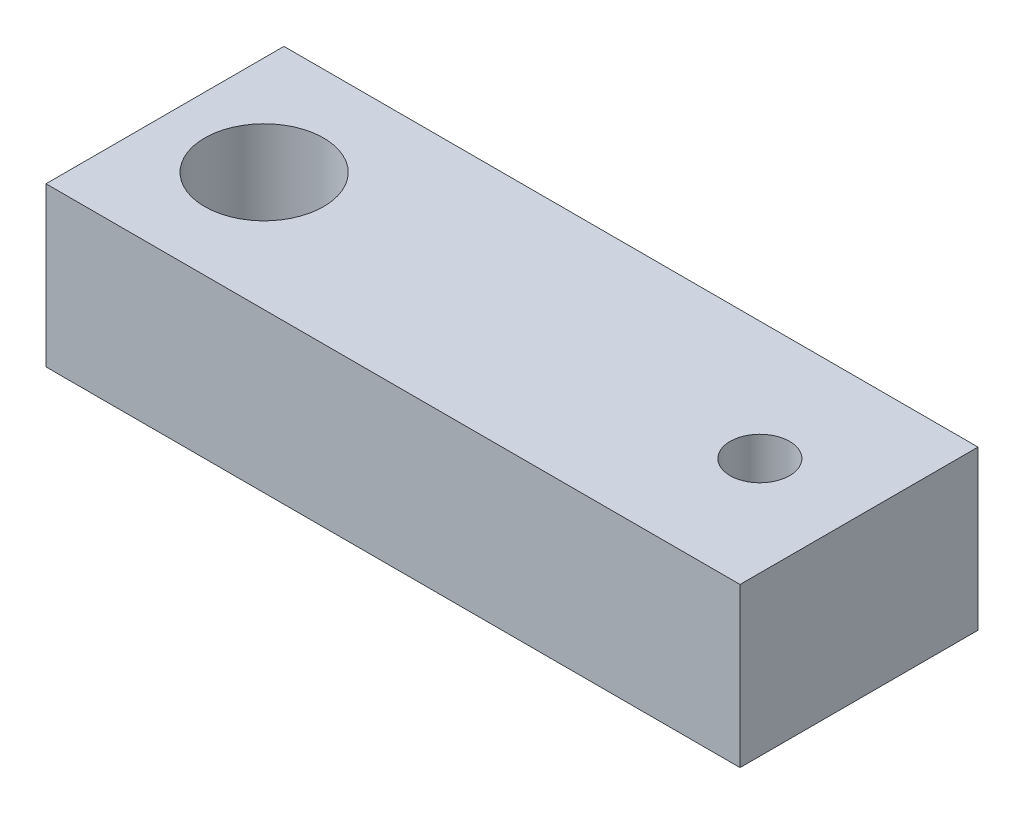
ISO-10303-21;
HEADER;
FILE_DESCRIPTION(('STEP AP214'),'2;1');
FILE_NAME('part.step','',(''),(''),'','','');
FILE_SCHEMA(('AUTOMOTIVE_DESIGN { 1 0 10303 214 1 1 1 1 }'));
ENDSEC;
DATA;
#1=APPLICATION_CONTEXT('core data for automotive mechanical design processes');
#2=APPLICATION_PROTOCOL_DEFINITION('international standard','automotive_design',2000,#1);
#3=PRODUCT_CONTEXT('',#1,'mechanical');
#4=PRODUCT('Part','Part','',(#3));
#5=PRODUCT_RELATED_PRODUCT_CATEGORY('part','',(#4));
#6=PRODUCT_DEFINITION_FORMATION('','',#4);
#7=PRODUCT_DEFINITION_CONTEXT('part definition',#1,'design');
#8=PRODUCT_DEFINITION('design','',#6,#7);
#9=PRODUCT_DEFINITION_SHAPE('','',#8);
#10=(LENGTH_UNIT() NAMED_UNIT(*) SI_UNIT(.MILLI.,.METRE.));
#11=(NAMED_UNIT(*) PLANE_ANGLE_UNIT() SI_UNIT($,.RADIAN.));
#12=(NAMED_UNIT(*) SI_UNIT($,.STERADIAN.) SOLID_ANGLE_UNIT());
#13=UNCERTAINTY_MEASURE_WITH_UNIT(LENGTH_MEASURE(1.E-05),#10,'distance_accuracy_value','');
#14=(GEOMETRIC_REPRESENTATION_CONTEXT(3) GLOBAL_UNCERTAINTY_ASSIGNED_CONTEXT((#13)) GLOBAL_UNIT_ASSIGNED_CONTEXT((#10,
#11,#12)) REPRESENTATION_CONTEXT('',''));
#15=CARTESIAN_POINT('',(0.,0.,0.));
#16=DIRECTION('',(0.,0.,1.));
#17=DIRECTION('',(1.,0.,0.));
#18=AXIS2_PLACEMENT_3D('',#15,#16,#17);
#19=CARTESIAN_POINT('',(0.,8.,0.));
#20=DIRECTION('',(0.,-1.,0.));
#21=DIRECTION('',(0.,0.,-1.));
#22=AXIS2_PLACEMENT_3D('',#19,#20,#21);
#23=PLANE('',#22);
#24=CARTESIAN_POINT('',(5.,8.,-6.));
#25=DIRECTION('',(0.,1.,0.));
#26=DIRECTION('',(0.,0.,1.));
#27=AXIS2_PLACEMENT_3D('',#24,#25,#26);
#28=CIRCLE('',#27,3.);
#29=CARTESIAN_POINT('',(5.,8.,-3.));
#30=VERTEX_POINT('',#29);
#31=EDGE_CURVE('E100',#30,#30,#28,.T.);
#32=ORIENTED_EDGE('',*,*,#31,.F.);
#33=EDGE_LOOP('',(#32));
#34=FACE_BOUND('',#33,.T.);
#35=DIRECTION('',(0.,0.,1.));
#36=VECTOR('',#35,1.);
#37=CARTESIAN_POINT('',(0.,8.,0.));
#38=LINE('',#37,#36);
#39=CARTESIAN_POINT('',(0.,8.,-12.));
#40=VERTEX_POINT('',#39);
#41=CARTESIAN_POINT('',(0.,8.,0.));
#42=VERTEX_POINT('',#41);
#43=EDGE_CURVE('E85',#40,#42,#38,.T.);
#44=ORIENTED_EDGE('',*,*,#43,.T.);
#45=DIRECTION('',(1.,0.,0.));
#46=VECTOR('',#45,1.);
#47=CARTESIAN_POINT('',(0.,8.,0.));
#48=LINE('',#47,#46);
#49=CARTESIAN_POINT('',(35.,8.,0.));
#50=VERTEX_POINT('',#49);
#51=EDGE_CURVE('E80',#42,#50,#48,.T.);
#52=ORIENTED_EDGE('',*,*,#51,.T.);
#53=DIRECTION('',(0.,0.,-1.));
#54=VECTOR('',#53,1.);
#55=CARTESIAN_POINT('',(35.,8.,0.));
#56=LINE('',#55,#54);
#57=CARTESIAN_POINT('',(35.,8.,-12.));
#58=VERTEX_POINT('',#57);
#59=EDGE_CURVE('E83',#50,#58,#56,.T.);
#60=ORIENTED_EDGE('',*,*,#59,.T.);
#61=DIRECTION('',(-1.,0.,0.));
#62=VECTOR('',#61,1.);
#63=CARTESIAN_POINT('',(0.,8.,-12.));
#64=LINE('',#63,#62);
#65=EDGE_CURVE('E50',#58,#40,#64,.T.);
#66=ORIENTED_EDGE('',*,*,#65,.T.);
#67=EDGE_LOOP('',(#44,#52,#60,#66));
#68=FACE_BOUND('',#67,.T.);
#69=CARTESIAN_POINT('',(30.,8.,-6.));
#70=DIRECTION('',(0.,1.,0.));
#71=DIRECTION('',(0.,0.,1.));
#72=AXIS2_PLACEMENT_3D('',#69,#70,#71);
#73=CIRCLE('',#72,1.50000000000001);
#74=CARTESIAN_POINT('',(30.,8.,-4.49999999999999));
#75=VERTEX_POINT('',#74);
#76=EDGE_CURVE('E115',#75,#75,#73,.T.);
#77=ORIENTED_EDGE('',*,*,#76,.F.);
#78=EDGE_LOOP('',(#77));
#79=FACE_BOUND('',#78,.T.);
#80=ADVANCED_FACE('F33',(#34,#68,#79),#23,.F.);
#81=CARTESIAN_POINT('',(0.,0.,0.));
#82=DIRECTION('',(0.,-1.,0.));
#83=DIRECTION('',(0.,0.,-1.));
#84=AXIS2_PLACEMENT_3D('',#81,#82,#83);
#85=PLANE('',#84);
#86=CARTESIAN_POINT('',(5.,0.,-6.));
#87=DIRECTION('',(0.,1.,0.));
#88=DIRECTION('',(0.,0.,1.));
#89=AXIS2_PLACEMENT_3D('',#86,#87,#88);
#90=CIRCLE('',#89,3.);
#91=CARTESIAN_POINT('',(5.,0.,-3.));
#92=VERTEX_POINT('',#91);
#93=EDGE_CURVE('E112',#92,#92,#90,.T.);
#94=ORIENTED_EDGE('',*,*,#93,.T.);
#95=EDGE_LOOP('',(#94));
#96=FACE_BOUND('',#95,.T.);
#97=DIRECTION('',(0.,0.,1.));
#98=VECTOR('',#97,1.);
#99=CARTESIAN_POINT('',(0.,0.,0.));
#100=LINE('',#99,#98);
#101=CARTESIAN_POINT('',(0.,0.,-12.));
#102=VERTEX_POINT('',#101);
#103=CARTESIAN_POINT('',(0.,0.,0.));
#104=VERTEX_POINT('',#103);
#105=EDGE_CURVE('E97',#102,#104,#100,.T.);
#106=ORIENTED_EDGE('',*,*,#105,.F.);
#107=DIRECTION('',(-1.,0.,0.));
#108=VECTOR('',#107,1.);
#109=CARTESIAN_POINT('',(0.,0.,-12.));
#110=LINE('',#109,#108);
#111=CARTESIAN_POINT('',(35.,0.,-12.));
#112=VERTEX_POINT('',#111);
#113=EDGE_CURVE('E73',#112,#102,#110,.T.);
#114=ORIENTED_EDGE('',*,*,#113,.F.);
#115=DIRECTION('',(0.,0.,-1.));
#116=VECTOR('',#115,1.);
#117=CARTESIAN_POINT('',(35.,0.,0.));
#118=LINE('',#117,#116);
#119=CARTESIAN_POINT('',(35.,0.,0.));
#120=VERTEX_POINT('',#119);
#121=EDGE_CURVE('E67',#120,#112,#118,.T.);
#122=ORIENTED_EDGE('',*,*,#121,.F.);
#123=DIRECTION('',(1.,0.,0.));
#124=VECTOR('',#123,1.);
#125=CARTESIAN_POINT('',(0.,0.,0.));
#126=LINE('',#125,#124);
#127=EDGE_CURVE('E89',#104,#120,#126,.T.);
#128=ORIENTED_EDGE('',*,*,#127,.F.);
#129=EDGE_LOOP('',(#106,#114,#122,#128));
#130=FACE_BOUND('',#129,.T.);
#131=CARTESIAN_POINT('',(30.,0.,-6.));
#132=DIRECTION('',(0.,1.,0.));
#133=DIRECTION('',(0.,0.,1.));
#134=AXIS2_PLACEMENT_3D('',#131,#132,#133);
#135=CIRCLE('',#134,1.50000000000001);
#136=CARTESIAN_POINT('',(30.,0.,-4.49999999999999));
#137=VERTEX_POINT('',#136);
#138=EDGE_CURVE('E118',#137,#137,#135,.T.);
#139=ORIENTED_EDGE('',*,*,#138,.T.);
#140=EDGE_LOOP('',(#139));
#141=FACE_BOUND('',#140,.T.);
#142=ADVANCED_FACE('F108',(#96,#130,#141),#85,.T.);
#143=CARTESIAN_POINT('',(0.,8.,0.));
#144=DIRECTION('',(1.,0.,0.));
#145=DIRECTION('',(0.,0.,-1.));
#146=AXIS2_PLACEMENT_3D('',#143,#144,#145);
#147=PLANE('',#146);
#148=ORIENTED_EDGE('',*,*,#105,.T.);
#149=DIRECTION('',(0.,-1.,0.));
#150=VECTOR('',#149,1.);
#151=CARTESIAN_POINT('',(0.,8.,0.));
#152=LINE('',#151,#150);
#153=EDGE_CURVE('E11',#42,#104,#152,.T.);
#154=ORIENTED_EDGE('',*,*,#153,.F.);
#155=ORIENTED_EDGE('',*,*,#43,.F.);
#156=DIRECTION('',(0.,-1.,0.));
#157=VECTOR('',#156,1.);
#158=CARTESIAN_POINT('',(0.,8.,-12.));
#159=LINE('',#158,#157);
#160=EDGE_CURVE('E93',#40,#102,#159,.T.);
#161=ORIENTED_EDGE('',*,*,#160,.T.);
#162=EDGE_LOOP('',(#148,#154,#155,#161));
#163=FACE_BOUND('',#162,.T.);
#164=ADVANCED_FACE('F35',(#163),#147,.F.);
#165=CARTESIAN_POINT('',(0.,8.,0.));
#166=DIRECTION('',(0.,0.,-1.));
#167=DIRECTION('',(-1.,0.,0.));
#168=AXIS2_PLACEMENT_3D('',#165,#166,#167);
#169=PLANE('',#168);
#170=ORIENTED_EDGE('',*,*,#127,.T.);
#171=DIRECTION('',(0.,-1.,0.));
#172=VECTOR('',#171,1.);
#173=CARTESIAN_POINT('',(35.,8.,0.));
#174=LINE('',#173,#172);
#175=EDGE_CURVE('E42',#50,#120,#174,.T.);
#176=ORIENTED_EDGE('',*,*,#175,.F.);
#177=ORIENTED_EDGE('',*,*,#51,.F.);
#178=ORIENTED_EDGE('',*,*,#153,.T.);
#179=EDGE_LOOP('',(#170,#176,#177,#178));
#180=FACE_BOUND('',#179,.T.);
#181=ADVANCED_FACE('F88',(#180),#169,.F.);
#182=CARTESIAN_POINT('',(35.,8.,0.));
#183=DIRECTION('',(-1.,0.,0.));
#184=DIRECTION('',(0.,0.,1.));
#185=AXIS2_PLACEMENT_3D('',#182,#183,#184);
#186=PLANE('',#185);
#187=ORIENTED_EDGE('',*,*,#121,.T.);
#188=DIRECTION('',(0.,-1.,0.));
#189=VECTOR('',#188,1.);
#190=CARTESIAN_POINT('',(35.,8.,-12.));
#191=LINE('',#190,#189);
#192=EDGE_CURVE('E90',#58,#112,#191,.T.);
#193=ORIENTED_EDGE('',*,*,#192,.F.);
#194=ORIENTED_EDGE('',*,*,#59,.F.);
#195=ORIENTED_EDGE('',*,*,#175,.T.);
#196=EDGE_LOOP('',(#187,#193,#194,#195));
#197=FACE_BOUND('',#196,.T.);
#198=ADVANCED_FACE('F91',(#197),#186,.F.);
#199=CARTESIAN_POINT('',(0.,8.,-12.));
#200=DIRECTION('',(0.,0.,1.));
#201=DIRECTION('',(1.,0.,0.));
#202=AXIS2_PLACEMENT_3D('',#199,#200,#201);
#203=PLANE('',#202);
#204=ORIENTED_EDGE('',*,*,#113,.T.);
#205=ORIENTED_EDGE('',*,*,#160,.F.);
#206=ORIENTED_EDGE('',*,*,#65,.F.);
#207=ORIENTED_EDGE('',*,*,#192,.T.);
#208=EDGE_LOOP('',(#204,#205,#206,#207));
#209=FACE_BOUND('',#208,.T.);
#210=ADVANCED_FACE('F105',(#209),#203,.F.);
#211=CARTESIAN_POINT('',(5.,8.,-6.));
#212=DIRECTION('',(0.,-1.,0.));
#213=DIRECTION('',(0.,0.,-1.));
#214=AXIS2_PLACEMENT_3D('',#211,#212,#213);
#215=CYLINDRICAL_SURFACE('',#214,3.);
#216=ORIENTED_EDGE('',*,*,#31,.T.);
#217=EDGE_LOOP('',(#216));
#218=FACE_BOUND('',#217,.T.);
#219=ORIENTED_EDGE('',*,*,#93,.F.);
#220=EDGE_LOOP('',(#219));
#221=FACE_BOUND('',#220,.T.);
#222=ADVANCED_FACE('F136',(#218,#221),#215,.F.);
#223=CARTESIAN_POINT('',(30.,8.,-6.));
#224=DIRECTION('',(0.,-1.,0.));
#225=DIRECTION('',(0.,0.,-1.));
#226=AXIS2_PLACEMENT_3D('',#223,#224,#225);
#227=CYLINDRICAL_SURFACE('',#226,1.50000000000001);
#228=ORIENTED_EDGE('',*,*,#76,.T.);
#229=EDGE_LOOP('',(#228));
#230=FACE_BOUND('',#229,.T.);
#231=ORIENTED_EDGE('',*,*,#138,.F.);
#232=EDGE_LOOP('',(#231));
#233=FACE_BOUND('',#232,.T.);
#234=ADVANCED_FACE('F124',(#230,#233),#227,.F.);
#235=CLOSED_SHELL('',(#80,#142,#164,#181,#198,#210,#222,#234));
#236=MANIFOLD_SOLID_BREP('B2',#235);
#237=ADVANCED_BREP_SHAPE_REPRESENTATION('',(#18,#236),#14);
#238=SHAPE_DEFINITION_REPRESENTATION(#9,#237);
ENDSEC;
END-ISO-10303-21;
